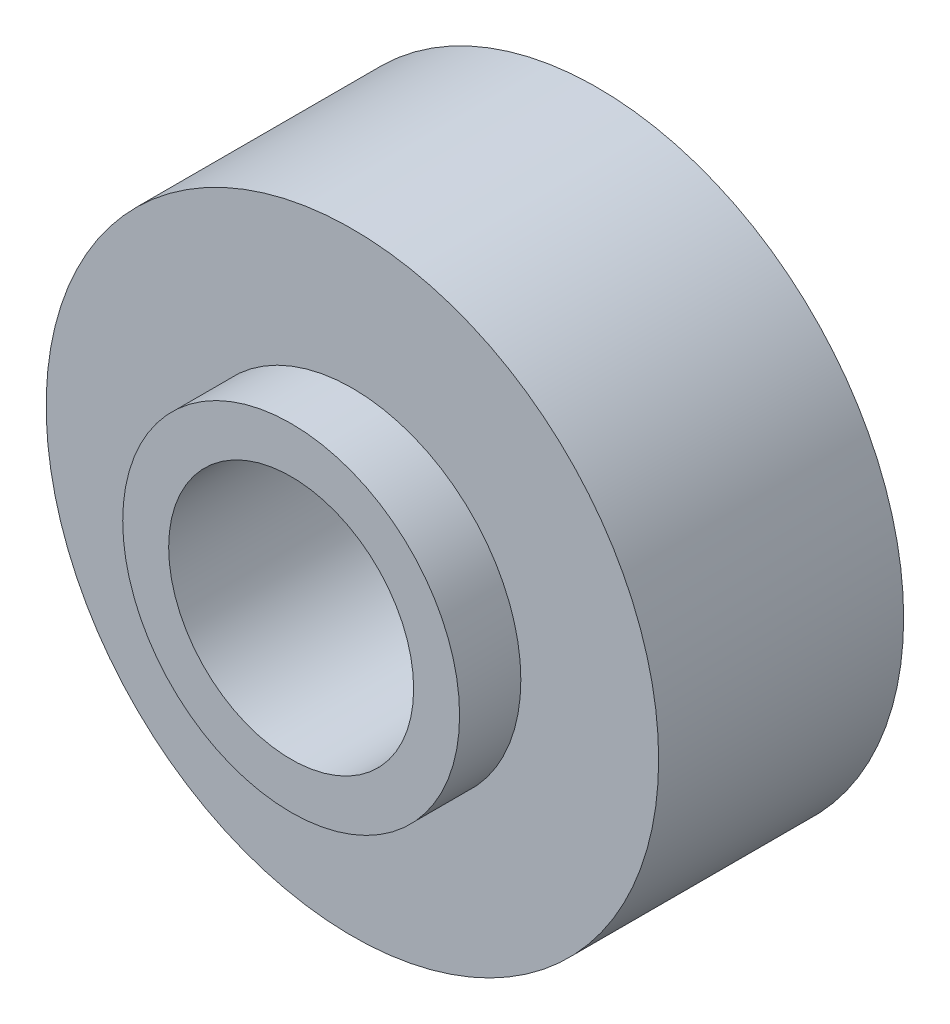
ISO-10303-21;
HEADER;
FILE_DESCRIPTION(('STEP AP214'),'2;1');
FILE_NAME('part.step','',(''),(''),'','','');
FILE_SCHEMA(('AUTOMOTIVE_DESIGN { 1 0 10303 214 1 1 1 1 }'));
ENDSEC;
DATA;
#1=APPLICATION_CONTEXT('core data for automotive mechanical design processes');
#2=APPLICATION_PROTOCOL_DEFINITION('international standard','automotive_design',2000,#1);
#3=PRODUCT_CONTEXT('',#1,'mechanical');
#4=PRODUCT('Part','Part','',(#3));
#5=PRODUCT_RELATED_PRODUCT_CATEGORY('part','',(#4));
#6=PRODUCT_DEFINITION_FORMATION('','',#4);
#7=PRODUCT_DEFINITION_CONTEXT('part definition',#1,'design');
#8=PRODUCT_DEFINITION('design','',#6,#7);
#9=PRODUCT_DEFINITION_SHAPE('','',#8);
#10=(LENGTH_UNIT() NAMED_UNIT(*) SI_UNIT(.MILLI.,.METRE.));
#11=(NAMED_UNIT(*) PLANE_ANGLE_UNIT() SI_UNIT($,.RADIAN.));
#12=(NAMED_UNIT(*) SI_UNIT($,.STERADIAN.) SOLID_ANGLE_UNIT());
#13=UNCERTAINTY_MEASURE_WITH_UNIT(LENGTH_MEASURE(1.E-05),#10,'distance_accuracy_value','');
#14=(GEOMETRIC_REPRESENTATION_CONTEXT(3) GLOBAL_UNCERTAINTY_ASSIGNED_CONTEXT((#13)) GLOBAL_UNIT_ASSIGNED_CONTEXT((#10,
#11,#12)) REPRESENTATION_CONTEXT('',''));
#15=CARTESIAN_POINT('',(0.,0.,0.));
#16=DIRECTION('',(0.,0.,1.));
#17=DIRECTION('',(1.,0.,0.));
#18=AXIS2_PLACEMENT_3D('',#15,#16,#17);
#19=CARTESIAN_POINT('',(0.,0.,-10.));
#20=DIRECTION('',(0.,0.,1.));
#21=DIRECTION('',(1.,0.,0.));
#22=AXIS2_PLACEMENT_3D('',#19,#20,#21);
#23=CYLINDRICAL_SURFACE('',#22,10.);
#24=CARTESIAN_POINT('',(0.,0.,-10.));
#25=DIRECTION('',(0.,0.,1.));
#26=DIRECTION('',(1.,0.,0.));
#27=AXIS2_PLACEMENT_3D('',#24,#25,#26);
#28=CIRCLE('',#27,10.);
#29=CARTESIAN_POINT('',(10.,0.,-10.));
#30=VERTEX_POINT('',#29);
#31=EDGE_CURVE('E10',#30,#30,#28,.T.);
#32=ORIENTED_EDGE('',*,*,#31,.T.);
#33=EDGE_LOOP('',(#32));
#34=FACE_BOUND('',#33,.T.);
#35=CARTESIAN_POINT('',(0.,0.,-2.));
#36=DIRECTION('',(0.,0.,1.));
#37=DIRECTION('',(1.,0.,0.));
#38=AXIS2_PLACEMENT_3D('',#35,#36,#37);
#39=CIRCLE('',#38,10.);
#40=CARTESIAN_POINT('',(10.,0.,-2.));
#41=VERTEX_POINT('',#40);
#42=EDGE_CURVE('E46',#41,#41,#39,.T.);
#43=ORIENTED_EDGE('',*,*,#42,.F.);
#44=EDGE_LOOP('',(#43));
#45=FACE_BOUND('',#44,.T.);
#46=ADVANCED_FACE('F31',(#34,#45),#23,.T.);
#47=CARTESIAN_POINT('',(0.,0.,0.));
#48=DIRECTION('',(0.,0.,1.));
#49=DIRECTION('',(1.,0.,0.));
#50=AXIS2_PLACEMENT_3D('',#47,#48,#49);
#51=PLANE('',#50);
#52=CARTESIAN_POINT('',(0.,0.,0.));
#53=DIRECTION('',(0.,0.,1.));
#54=DIRECTION('',(1.,0.,0.));
#55=AXIS2_PLACEMENT_3D('',#52,#53,#54);
#56=CIRCLE('',#55,4.);
#57=CARTESIAN_POINT('',(4.,0.,0.));
#58=VERTEX_POINT('',#57);
#59=EDGE_CURVE('E41',#58,#58,#56,.T.);
#60=ORIENTED_EDGE('',*,*,#59,.F.);
#61=EDGE_LOOP('',(#60));
#62=FACE_BOUND('',#61,.T.);
#63=CARTESIAN_POINT('',(0.,0.,0.));
#64=DIRECTION('',(0.,0.,1.));
#65=DIRECTION('',(1.,0.,0.));
#66=AXIS2_PLACEMENT_3D('',#63,#64,#65);
#67=CIRCLE('',#66,5.5);
#68=CARTESIAN_POINT('',(5.5,0.,0.));
#69=VERTEX_POINT('',#68);
#70=EDGE_CURVE('E51',#69,#69,#67,.T.);
#71=ORIENTED_EDGE('',*,*,#70,.T.);
#72=EDGE_LOOP('',(#71));
#73=FACE_BOUND('',#72,.T.);
#74=ADVANCED_FACE('F68',(#62,#73),#51,.T.);
#75=CARTESIAN_POINT('',(0.,0.,-10.));
#76=DIRECTION('',(0.,0.,1.));
#77=DIRECTION('',(1.,0.,0.));
#78=AXIS2_PLACEMENT_3D('',#75,#76,#77);
#79=PLANE('',#78);
#80=CARTESIAN_POINT('',(0.,0.,-10.));
#81=DIRECTION('',(0.,0.,1.));
#82=DIRECTION('',(1.,0.,0.));
#83=AXIS2_PLACEMENT_3D('',#80,#81,#82);
#84=CIRCLE('',#83,4.);
#85=CARTESIAN_POINT('',(4.,0.,-10.));
#86=VERTEX_POINT('',#85);
#87=EDGE_CURVE('E37',#86,#86,#84,.T.);
#88=ORIENTED_EDGE('',*,*,#87,.T.);
#89=EDGE_LOOP('',(#88));
#90=FACE_BOUND('',#89,.T.);
#91=ORIENTED_EDGE('',*,*,#31,.F.);
#92=EDGE_LOOP('',(#91));
#93=FACE_BOUND('',#92,.T.);
#94=ADVANCED_FACE('F73',(#90,#93),#79,.F.);
#95=CARTESIAN_POINT('',(0.,0.,-10.));
#96=DIRECTION('',(0.,0.,1.));
#97=DIRECTION('',(1.,0.,0.));
#98=AXIS2_PLACEMENT_3D('',#95,#96,#97);
#99=CYLINDRICAL_SURFACE('',#98,4.);
#100=ORIENTED_EDGE('',*,*,#87,.F.);
#101=EDGE_LOOP('',(#100));
#102=FACE_BOUND('',#101,.T.);
#103=ORIENTED_EDGE('',*,*,#59,.T.);
#104=EDGE_LOOP('',(#103));
#105=FACE_BOUND('',#104,.T.);
#106=ADVANCED_FACE('F63',(#102,#105),#99,.F.);
#107=CARTESIAN_POINT('',(0.,0.,-2.));
#108=DIRECTION('',(0.,0.,1.));
#109=DIRECTION('',(1.,0.,0.));
#110=AXIS2_PLACEMENT_3D('',#107,#108,#109);
#111=PLANE('',#110);
#112=CARTESIAN_POINT('',(0.,0.,-2.));
#113=DIRECTION('',(0.,0.,1.));
#114=DIRECTION('',(1.,0.,0.));
#115=AXIS2_PLACEMENT_3D('',#112,#113,#114);
#116=CIRCLE('',#115,5.5);
#117=CARTESIAN_POINT('',(5.5,0.,-2.));
#118=VERTEX_POINT('',#117);
#119=EDGE_CURVE('E50',#118,#118,#116,.T.);
#120=ORIENTED_EDGE('',*,*,#119,.F.);
#121=EDGE_LOOP('',(#120));
#122=FACE_BOUND('',#121,.T.);
#123=ORIENTED_EDGE('',*,*,#42,.T.);
#124=EDGE_LOOP('',(#123));
#125=FACE_BOUND('',#124,.T.);
#126=ADVANCED_FACE('F60',(#122,#125),#111,.T.);
#127=CARTESIAN_POINT('',(0.,0.,-2.));
#128=DIRECTION('',(0.,0.,1.));
#129=DIRECTION('',(1.,0.,0.));
#130=AXIS2_PLACEMENT_3D('',#127,#128,#129);
#131=CYLINDRICAL_SURFACE('',#130,5.5);
#132=ORIENTED_EDGE('',*,*,#119,.T.);
#133=EDGE_LOOP('',(#132));
#134=FACE_BOUND('',#133,.T.);
#135=ORIENTED_EDGE('',*,*,#70,.F.);
#136=EDGE_LOOP('',(#135));
#137=FACE_BOUND('',#136,.T.);
#138=ADVANCED_FACE('F57',(#134,#137),#131,.T.);
#139=CLOSED_SHELL('',(#46,#74,#94,#106,#126,#138));
#140=MANIFOLD_SOLID_BREP('B2',#139);
#141=ADVANCED_BREP_SHAPE_REPRESENTATION('',(#18,#140),#14);
#142=SHAPE_DEFINITION_REPRESENTATION(#9,#141);
ENDSEC;
END-ISO-10303-21;
